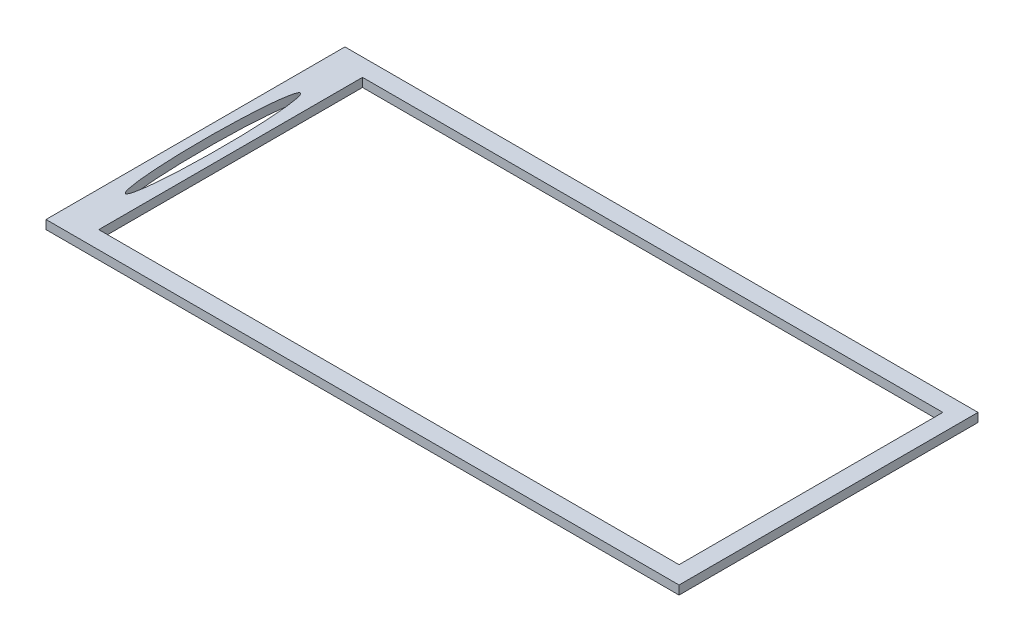
ISO-10303-21;
HEADER;
FILE_DESCRIPTION(('STEP AP214'),'2;1');
FILE_NAME('part.step','',(''),(''),'','','');
FILE_SCHEMA(('AUTOMOTIVE_DESIGN { 1 0 10303 214 1 1 1 1 }'));
ENDSEC;
DATA;
#1=APPLICATION_CONTEXT('core data for automotive mechanical design processes');
#2=APPLICATION_PROTOCOL_DEFINITION('international standard','automotive_design',2000,#1);
#3=PRODUCT_CONTEXT('',#1,'mechanical');
#4=PRODUCT('Part','Part','',(#3));
#5=PRODUCT_RELATED_PRODUCT_CATEGORY('part','',(#4));
#6=PRODUCT_DEFINITION_FORMATION('','',#4);
#7=PRODUCT_DEFINITION_CONTEXT('part definition',#1,'design');
#8=PRODUCT_DEFINITION('design','',#6,#7);
#9=PRODUCT_DEFINITION_SHAPE('','',#8);
#10=(LENGTH_UNIT() NAMED_UNIT(*) SI_UNIT(.MILLI.,.METRE.));
#11=(NAMED_UNIT(*) PLANE_ANGLE_UNIT() SI_UNIT($,.RADIAN.));
#12=(NAMED_UNIT(*) SI_UNIT($,.STERADIAN.) SOLID_ANGLE_UNIT());
#13=UNCERTAINTY_MEASURE_WITH_UNIT(LENGTH_MEASURE(1.E-05),#10,'distance_accuracy_value','');
#14=(GEOMETRIC_REPRESENTATION_CONTEXT(3) GLOBAL_UNCERTAINTY_ASSIGNED_CONTEXT((#13)) GLOBAL_UNIT_ASSIGNED_CONTEXT((#10,
#11,#12)) REPRESENTATION_CONTEXT('',''));
#15=CARTESIAN_POINT('',(0.,0.,0.));
#16=DIRECTION('',(0.,0.,1.));
#17=DIRECTION('',(1.,0.,0.));
#18=AXIS2_PLACEMENT_3D('',#15,#16,#17);
#19=CARTESIAN_POINT('',(360.,10.,170.));
#20=DIRECTION('',(-1.,0.,0.));
#21=DIRECTION('',(0.,0.,1.));
#22=AXIS2_PLACEMENT_3D('',#19,#20,#21);
#23=PLANE('',#22);
#24=DIRECTION('',(0.,0.,-1.));
#25=VECTOR('',#24,1.);
#26=CARTESIAN_POINT('',(360.,0.,170.));
#27=LINE('',#26,#25);
#28=CARTESIAN_POINT('',(360.,0.,170.));
#29=VERTEX_POINT('',#28);
#30=CARTESIAN_POINT('',(360.,0.,-170.));
#31=VERTEX_POINT('',#30);
#32=EDGE_CURVE('E134',#29,#31,#27,.T.);
#33=ORIENTED_EDGE('',*,*,#32,.T.);
#34=DIRECTION('',(0.,-1.,0.));
#35=VECTOR('',#34,1.);
#36=CARTESIAN_POINT('',(360.,10.,-170.));
#37=LINE('',#36,#35);
#38=CARTESIAN_POINT('',(360.,10.,-170.));
#39=VERTEX_POINT('',#38);
#40=EDGE_CURVE('E11',#39,#31,#37,.T.);
#41=ORIENTED_EDGE('',*,*,#40,.F.);
#42=DIRECTION('',(0.,0.,-1.));
#43=VECTOR('',#42,1.);
#44=CARTESIAN_POINT('',(360.,10.,170.));
#45=LINE('',#44,#43);
#46=CARTESIAN_POINT('',(360.,10.,170.));
#47=VERTEX_POINT('',#46);
#48=EDGE_CURVE('E135',#47,#39,#45,.T.);
#49=ORIENTED_EDGE('',*,*,#48,.F.);
#50=DIRECTION('',(0.,-1.,0.));
#51=VECTOR('',#50,1.);
#52=CARTESIAN_POINT('',(360.,10.,170.));
#53=LINE('',#52,#51);
#54=EDGE_CURVE('E145',#47,#29,#53,.T.);
#55=ORIENTED_EDGE('',*,*,#54,.T.);
#56=EDGE_LOOP('',(#33,#41,#49,#55));
#57=FACE_BOUND('',#56,.T.);
#58=ADVANCED_FACE('F33',(#57),#23,.F.);
#59=CARTESIAN_POINT('',(-360.,10.,-170.));
#60=DIRECTION('',(0.,0.,1.));
#61=DIRECTION('',(1.,0.,0.));
#62=AXIS2_PLACEMENT_3D('',#59,#60,#61);
#63=PLANE('',#62);
#64=DIRECTION('',(-1.,0.,0.));
#65=VECTOR('',#64,1.);
#66=CARTESIAN_POINT('',(-360.,0.,-170.));
#67=LINE('',#66,#65);
#68=CARTESIAN_POINT('',(-360.,0.,-170.));
#69=VERTEX_POINT('',#68);
#70=EDGE_CURVE('E148',#31,#69,#67,.T.);
#71=ORIENTED_EDGE('',*,*,#70,.T.);
#72=DIRECTION('',(0.,-1.,0.));
#73=VECTOR('',#72,1.);
#74=CARTESIAN_POINT('',(-360.,10.,-170.));
#75=LINE('',#74,#73);
#76=CARTESIAN_POINT('',(-360.,10.,-170.));
#77=VERTEX_POINT('',#76);
#78=EDGE_CURVE('E40',#77,#69,#75,.T.);
#79=ORIENTED_EDGE('',*,*,#78,.F.);
#80=DIRECTION('',(-1.,0.,0.));
#81=VECTOR('',#80,1.);
#82=CARTESIAN_POINT('',(-360.,10.,-170.));
#83=LINE('',#82,#81);
#84=EDGE_CURVE('E138',#39,#77,#83,.T.);
#85=ORIENTED_EDGE('',*,*,#84,.F.);
#86=ORIENTED_EDGE('',*,*,#40,.T.);
#87=EDGE_LOOP('',(#71,#79,#85,#86));
#88=FACE_BOUND('',#87,.T.);
#89=ADVANCED_FACE('F176',(#88),#63,.F.);
#90=CARTESIAN_POINT('',(-360.,10.,170.));
#91=DIRECTION('',(1.,0.,0.));
#92=DIRECTION('',(0.,0.,-1.));
#93=AXIS2_PLACEMENT_3D('',#90,#91,#92);
#94=PLANE('',#93);
#95=DIRECTION('',(0.,0.,1.));
#96=VECTOR('',#95,1.);
#97=CARTESIAN_POINT('',(-360.,0.,170.));
#98=LINE('',#97,#96);
#99=CARTESIAN_POINT('',(-360.,0.,170.));
#100=VERTEX_POINT('',#99);
#101=EDGE_CURVE('E150',#69,#100,#98,.T.);
#102=ORIENTED_EDGE('',*,*,#101,.T.);
#103=DIRECTION('',(0.,-1.,0.));
#104=VECTOR('',#103,1.);
#105=CARTESIAN_POINT('',(-360.,10.,170.));
#106=LINE('',#105,#104);
#107=CARTESIAN_POINT('',(-360.,10.,170.));
#108=VERTEX_POINT('',#107);
#109=EDGE_CURVE('E155',#108,#100,#106,.T.);
#110=ORIENTED_EDGE('',*,*,#109,.F.);
#111=DIRECTION('',(0.,0.,1.));
#112=VECTOR('',#111,1.);
#113=CARTESIAN_POINT('',(-360.,10.,170.));
#114=LINE('',#113,#112);
#115=EDGE_CURVE('E141',#77,#108,#114,.T.);
#116=ORIENTED_EDGE('',*,*,#115,.F.);
#117=ORIENTED_EDGE('',*,*,#78,.T.);
#118=EDGE_LOOP('',(#102,#110,#116,#117));
#119=FACE_BOUND('',#118,.T.);
#120=ADVANCED_FACE('F162',(#119),#94,.F.);
#121=CARTESIAN_POINT('',(-360.,10.,170.));
#122=DIRECTION('',(0.,0.,-1.));
#123=DIRECTION('',(-1.,0.,0.));
#124=AXIS2_PLACEMENT_3D('',#121,#122,#123);
#125=PLANE('',#124);
#126=DIRECTION('',(1.,0.,0.));
#127=VECTOR('',#126,1.);
#128=CARTESIAN_POINT('',(-360.,0.,170.));
#129=LINE('',#128,#127);
#130=EDGE_CURVE('E139',#100,#29,#129,.T.);
#131=ORIENTED_EDGE('',*,*,#130,.T.);
#132=ORIENTED_EDGE('',*,*,#54,.F.);
#133=DIRECTION('',(1.,0.,0.));
#134=VECTOR('',#133,1.);
#135=CARTESIAN_POINT('',(-360.,10.,170.));
#136=LINE('',#135,#134);
#137=EDGE_CURVE('E143',#108,#47,#136,.T.);
#138=ORIENTED_EDGE('',*,*,#137,.F.);
#139=ORIENTED_EDGE('',*,*,#109,.T.);
#140=EDGE_LOOP('',(#131,#132,#138,#139));
#141=FACE_BOUND('',#140,.T.);
#142=ADVANCED_FACE('F169',(#141),#125,.F.);
#143=CARTESIAN_POINT('',(0.,10.,0.));
#144=DIRECTION('',(0.,-1.,0.));
#145=DIRECTION('',(0.,0.,-1.));
#146=AXIS2_PLACEMENT_3D('',#143,#144,#145);
#147=PLANE('',#146);
#148=CARTESIAN_POINT('',(-340.089850217013,10.,0.));
#149=DIRECTION('',(0.,1.,0.));
#150=DIRECTION('',(0.,0.,-1.));
#151=AXIS2_PLACEMENT_3D('',#148,#149,#150);
#152=ELLIPSE('',#151,99.333174073286,8.97926997272636);
#153=CARTESIAN_POINT('',(-340.089850217013,10.,-99.333174073286));
#154=VERTEX_POINT('',#153);
#155=EDGE_CURVE('E213',#154,#154,#152,.T.);
#156=ORIENTED_EDGE('',*,*,#155,.F.);
#157=EDGE_LOOP('',(#156));
#158=FACE_BOUND('',#157,.T.);
#159=DIRECTION('',(0.,0.,1.));
#160=VECTOR('',#159,1.);
#161=CARTESIAN_POINT('',(-320.,10.,-150.));
#162=LINE('',#161,#160);
#163=CARTESIAN_POINT('',(-320.,10.,-150.));
#164=VERTEX_POINT('',#163);
#165=CARTESIAN_POINT('',(-320.,10.,150.));
#166=VERTEX_POINT('',#165);
#167=EDGE_CURVE('E121',#164,#166,#162,.T.);
#168=ORIENTED_EDGE('',*,*,#167,.F.);
#169=DIRECTION('',(-1.,0.,0.));
#170=VECTOR('',#169,1.);
#171=CARTESIAN_POINT('',(340.,10.,-150.));
#172=LINE('',#171,#170);
#173=CARTESIAN_POINT('',(340.,10.,-150.));
#174=VERTEX_POINT('',#173);
#175=EDGE_CURVE('E114',#174,#164,#172,.T.);
#176=ORIENTED_EDGE('',*,*,#175,.F.);
#177=DIRECTION('',(0.,0.,-1.));
#178=VECTOR('',#177,1.);
#179=CARTESIAN_POINT('',(340.,10.,-150.));
#180=LINE('',#179,#178);
#181=CARTESIAN_POINT('',(340.,10.,150.));
#182=VERTEX_POINT('',#181);
#183=EDGE_CURVE('E125',#182,#174,#180,.T.);
#184=ORIENTED_EDGE('',*,*,#183,.F.);
#185=DIRECTION('',(1.,0.,0.));
#186=VECTOR('',#185,1.);
#187=CARTESIAN_POINT('',(340.,10.,150.));
#188=LINE('',#187,#186);
#189=EDGE_CURVE('E47',#166,#182,#188,.T.);
#190=ORIENTED_EDGE('',*,*,#189,.F.);
#191=EDGE_LOOP('',(#168,#176,#184,#190));
#192=FACE_BOUND('',#191,.T.);
#193=ORIENTED_EDGE('',*,*,#48,.T.);
#194=ORIENTED_EDGE('',*,*,#84,.T.);
#195=ORIENTED_EDGE('',*,*,#115,.T.);
#196=ORIENTED_EDGE('',*,*,#137,.T.);
#197=EDGE_LOOP('',(#193,#194,#195,#196));
#198=FACE_BOUND('',#197,.T.);
#199=ADVANCED_FACE('F175',(#158,#192,#198),#147,.F.);
#200=CARTESIAN_POINT('',(0.,0.,0.));
#201=DIRECTION('',(0.,-1.,0.));
#202=DIRECTION('',(0.,0.,-1.));
#203=AXIS2_PLACEMENT_3D('',#200,#201,#202);
#204=PLANE('',#203);
#205=CARTESIAN_POINT('',(-340.089850217013,0.,0.));
#206=DIRECTION('',(0.,1.,0.));
#207=DIRECTION('',(0.,0.,-1.));
#208=AXIS2_PLACEMENT_3D('',#205,#206,#207);
#209=ELLIPSE('',#208,99.333174073286,8.97926997272636);
#210=CARTESIAN_POINT('',(-340.089850217013,0.,-99.333174073286));
#211=VERTEX_POINT('',#210);
#212=EDGE_CURVE('E208',#211,#211,#209,.T.);
#213=ORIENTED_EDGE('',*,*,#212,.T.);
#214=EDGE_LOOP('',(#213));
#215=FACE_BOUND('',#214,.T.);
#216=DIRECTION('',(-1.,0.,0.));
#217=VECTOR('',#216,1.);
#218=CARTESIAN_POINT('',(340.,0.,-150.));
#219=LINE('',#218,#217);
#220=CARTESIAN_POINT('',(340.,0.,-150.));
#221=VERTEX_POINT('',#220);
#222=CARTESIAN_POINT('',(-320.,0.,-150.));
#223=VERTEX_POINT('',#222);
#224=EDGE_CURVE('E111',#221,#223,#219,.T.);
#225=ORIENTED_EDGE('',*,*,#224,.T.);
#226=DIRECTION('',(0.,0.,1.));
#227=VECTOR('',#226,1.);
#228=CARTESIAN_POINT('',(-320.,0.,-150.));
#229=LINE('',#228,#227);
#230=CARTESIAN_POINT('',(-320.,0.,150.));
#231=VERTEX_POINT('',#230);
#232=EDGE_CURVE('E98',#223,#231,#229,.T.);
#233=ORIENTED_EDGE('',*,*,#232,.T.);
#234=DIRECTION('',(1.,0.,0.));
#235=VECTOR('',#234,1.);
#236=CARTESIAN_POINT('',(340.,0.,150.));
#237=LINE('',#236,#235);
#238=CARTESIAN_POINT('',(340.,0.,150.));
#239=VERTEX_POINT('',#238);
#240=EDGE_CURVE('E129',#231,#239,#237,.T.);
#241=ORIENTED_EDGE('',*,*,#240,.T.);
#242=DIRECTION('',(0.,0.,-1.));
#243=VECTOR('',#242,1.);
#244=CARTESIAN_POINT('',(340.,0.,-150.));
#245=LINE('',#244,#243);
#246=EDGE_CURVE('E119',#239,#221,#245,.T.);
#247=ORIENTED_EDGE('',*,*,#246,.T.);
#248=EDGE_LOOP('',(#225,#233,#241,#247));
#249=FACE_BOUND('',#248,.T.);
#250=ORIENTED_EDGE('',*,*,#32,.F.);
#251=ORIENTED_EDGE('',*,*,#130,.F.);
#252=ORIENTED_EDGE('',*,*,#101,.F.);
#253=ORIENTED_EDGE('',*,*,#70,.F.);
#254=EDGE_LOOP('',(#250,#251,#252,#253));
#255=FACE_BOUND('',#254,.T.);
#256=ADVANCED_FACE('F117',(#215,#249,#255),#204,.T.);
#257=CARTESIAN_POINT('',(340.,-724.982758415675,-150.));
#258=DIRECTION('',(0.,0.,-1.));
#259=DIRECTION('',(-1.,0.,0.));
#260=AXIS2_PLACEMENT_3D('',#257,#258,#259);
#261=PLANE('',#260);
#262=DIRECTION('',(0.,1.,0.));
#263=VECTOR('',#262,1.);
#264=CARTESIAN_POINT('',(340.,-724.982758415675,-150.));
#265=LINE('',#264,#263);
#266=EDGE_CURVE('E55',#221,#174,#265,.T.);
#267=ORIENTED_EDGE('',*,*,#266,.T.);
#268=ORIENTED_EDGE('',*,*,#175,.T.);
#269=DIRECTION('',(0.,1.,0.));
#270=VECTOR('',#269,1.);
#271=CARTESIAN_POINT('',(-320.,-724.982758415675,-150.));
#272=LINE('',#271,#270);
#273=EDGE_CURVE('E102',#223,#164,#272,.T.);
#274=ORIENTED_EDGE('',*,*,#273,.F.);
#275=ORIENTED_EDGE('',*,*,#224,.F.);
#276=EDGE_LOOP('',(#267,#268,#274,#275));
#277=FACE_BOUND('',#276,.T.);
#278=ADVANCED_FACE('F110',(#277),#261,.F.);
#279=CARTESIAN_POINT('',(-320.,-724.982758415675,-150.));
#280=DIRECTION('',(-1.,0.,0.));
#281=DIRECTION('',(0.,0.,1.));
#282=AXIS2_PLACEMENT_3D('',#279,#280,#281);
#283=PLANE('',#282);
#284=ORIENTED_EDGE('',*,*,#273,.T.);
#285=ORIENTED_EDGE('',*,*,#167,.T.);
#286=DIRECTION('',(0.,1.,0.));
#287=VECTOR('',#286,1.);
#288=CARTESIAN_POINT('',(-320.,-724.982758415675,150.));
#289=LINE('',#288,#287);
#290=EDGE_CURVE('E104',#231,#166,#289,.T.);
#291=ORIENTED_EDGE('',*,*,#290,.F.);
#292=ORIENTED_EDGE('',*,*,#232,.F.);
#293=EDGE_LOOP('',(#284,#285,#291,#292));
#294=FACE_BOUND('',#293,.T.);
#295=ADVANCED_FACE('F100',(#294),#283,.F.);
#296=CARTESIAN_POINT('',(340.,-724.982758415675,150.));
#297=DIRECTION('',(0.,0.,1.));
#298=DIRECTION('',(1.,0.,0.));
#299=AXIS2_PLACEMENT_3D('',#296,#297,#298);
#300=PLANE('',#299);
#301=ORIENTED_EDGE('',*,*,#290,.T.);
#302=ORIENTED_EDGE('',*,*,#189,.T.);
#303=DIRECTION('',(0.,1.,0.));
#304=VECTOR('',#303,1.);
#305=CARTESIAN_POINT('',(340.,-724.982758415675,150.));
#306=LINE('',#305,#304);
#307=EDGE_CURVE('E128',#239,#182,#306,.T.);
#308=ORIENTED_EDGE('',*,*,#307,.F.);
#309=ORIENTED_EDGE('',*,*,#240,.F.);
#310=EDGE_LOOP('',(#301,#302,#308,#309));
#311=FACE_BOUND('',#310,.T.);
#312=ADVANCED_FACE('F196',(#311),#300,.F.);
#313=CARTESIAN_POINT('',(340.,-724.982758415675,-150.));
#314=DIRECTION('',(1.,0.,0.));
#315=DIRECTION('',(0.,0.,-1.));
#316=AXIS2_PLACEMENT_3D('',#313,#314,#315);
#317=PLANE('',#316);
#318=ORIENTED_EDGE('',*,*,#307,.T.);
#319=ORIENTED_EDGE('',*,*,#183,.T.);
#320=ORIENTED_EDGE('',*,*,#266,.F.);
#321=ORIENTED_EDGE('',*,*,#246,.F.);
#322=EDGE_LOOP('',(#318,#319,#320,#321));
#323=FACE_BOUND('',#322,.T.);
#324=ADVANCED_FACE('F199',(#323),#317,.F.);
#325=CARTESIAN_POINT('',(-340.089850217013,-724.982758415675,0.));
#326=DIRECTION('',(0.,1.,0.));
#327=DIRECTION('',(0.,0.,-1.));
#328=AXIS2_PLACEMENT_3D('',#325,#326,#327);
#329=ELLIPSE('',#328,99.333174073286,8.97926997272636);
#330=DIRECTION('',(0.,1.,0.));
#331=VECTOR('',#330,1.);
#332=SURFACE_OF_LINEAR_EXTRUSION('',#329,#331);
#333=ORIENTED_EDGE('',*,*,#155,.T.);
#334=EDGE_LOOP('',(#333));
#335=FACE_BOUND('',#334,.T.);
#336=ORIENTED_EDGE('',*,*,#212,.F.);
#337=EDGE_LOOP('',(#336));
#338=FACE_BOUND('',#337,.T.);
#339=ADVANCED_FACE('F202',(#335,#338),#332,.F.);
#340=CLOSED_SHELL('',(#58,#89,#120,#142,#199,#256,#278,#295,#312,#324,#339));
#341=MANIFOLD_SOLID_BREP('B2',#340);
#342=ADVANCED_BREP_SHAPE_REPRESENTATION('',(#18,#341),#14);
#343=SHAPE_DEFINITION_REPRESENTATION(#9,#342);
ENDSEC;
END-ISO-10303-21;
